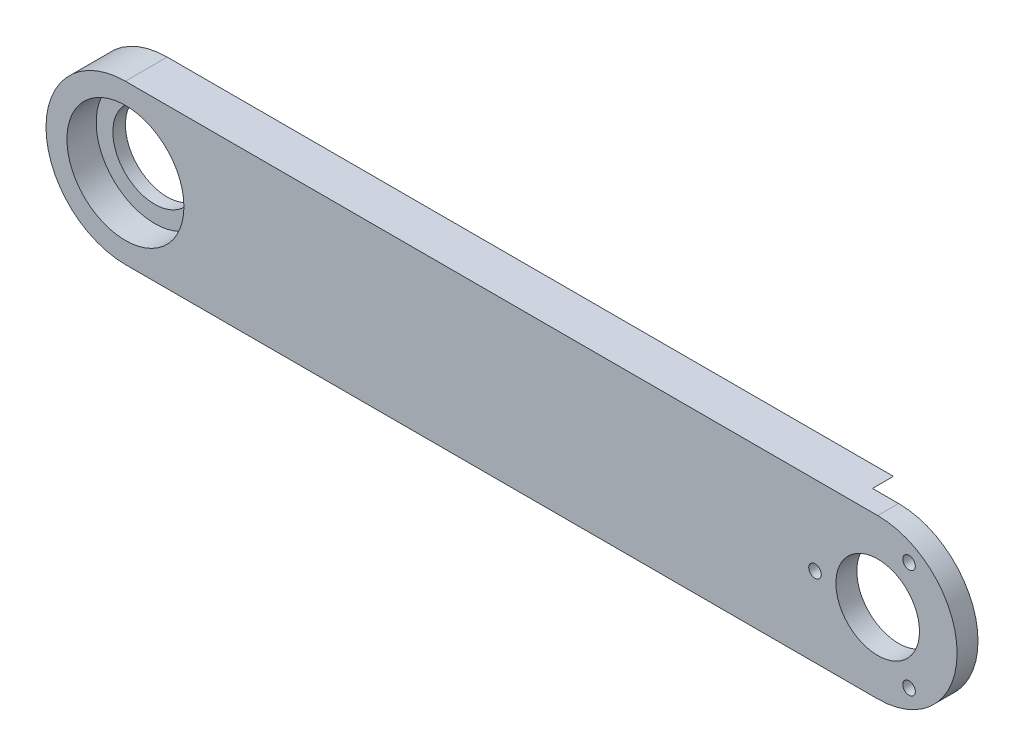
ISO-10303-21;
HEADER;
FILE_DESCRIPTION(('STEP AP214'),'2;1');
FILE_NAME('part.step','',(''),(''),'','','');
FILE_SCHEMA(('AUTOMOTIVE_DESIGN { 1 0 10303 214 1 1 1 1 }'));
ENDSEC;
DATA;
#1=APPLICATION_CONTEXT('core data for automotive mechanical design processes');
#2=APPLICATION_PROTOCOL_DEFINITION('international standard','automotive_design',2000,#1);
#3=PRODUCT_CONTEXT('',#1,'mechanical');
#4=PRODUCT('Part','Part','',(#3));
#5=PRODUCT_RELATED_PRODUCT_CATEGORY('part','',(#4));
#6=PRODUCT_DEFINITION_FORMATION('','',#4);
#7=PRODUCT_DEFINITION_CONTEXT('part definition',#1,'design');
#8=PRODUCT_DEFINITION('design','',#6,#7);
#9=PRODUCT_DEFINITION_SHAPE('','',#8);
#10=(LENGTH_UNIT() NAMED_UNIT(*) SI_UNIT(.MILLI.,.METRE.));
#11=(NAMED_UNIT(*) PLANE_ANGLE_UNIT() SI_UNIT($,.RADIAN.));
#12=(NAMED_UNIT(*) SI_UNIT($,.STERADIAN.) SOLID_ANGLE_UNIT());
#13=UNCERTAINTY_MEASURE_WITH_UNIT(LENGTH_MEASURE(1.E-05),#10,'distance_accuracy_value','');
#14=(GEOMETRIC_REPRESENTATION_CONTEXT(3) GLOBAL_UNCERTAINTY_ASSIGNED_CONTEXT((#13)) GLOBAL_UNIT_ASSIGNED_CONTEXT((#10,
#11,#12)) REPRESENTATION_CONTEXT('',''));
#15=CARTESIAN_POINT('',(0.,0.,0.));
#16=DIRECTION('',(0.,0.,1.));
#17=DIRECTION('',(1.,0.,0.));
#18=AXIS2_PLACEMENT_3D('',#15,#16,#17);
#19=CARTESIAN_POINT('',(0.,-19.,10.));
#20=DIRECTION('',(0.,1.,0.));
#21=DIRECTION('',(-1.,0.,0.));
#22=AXIS2_PLACEMENT_3D('',#19,#20,#21);
#23=PLANE('',#22);
#24=DIRECTION('',(0.,0.,-1.));
#25=VECTOR('',#24,1.);
#26=CARTESIAN_POINT('',(83.7550020016016,-19.,5.));
#27=LINE('',#26,#25);
#28=CARTESIAN_POINT('',(83.7550020016016,-19.,5.));
#29=VERTEX_POINT('',#28);
#30=CARTESIAN_POINT('',(83.7550020016016,-19.,0.));
#31=VERTEX_POINT('',#30);
#32=EDGE_CURVE('E55',#29,#31,#27,.T.);
#33=ORIENTED_EDGE('',*,*,#32,.F.);
#34=DIRECTION('',(1.,0.,0.));
#35=VECTOR('',#34,1.);
#36=CARTESIAN_POINT('',(0.,-19.,5.));
#37=LINE('',#36,#35);
#38=CARTESIAN_POINT('',(90.,-19.,5.));
#39=VERTEX_POINT('',#38);
#40=EDGE_CURVE('E116',#29,#39,#37,.T.);
#41=ORIENTED_EDGE('',*,*,#40,.T.);
#42=DIRECTION('',(0.,0.,-1.));
#43=VECTOR('',#42,1.);
#44=CARTESIAN_POINT('',(90.,-19.,10.));
#45=LINE('',#44,#43);
#46=CARTESIAN_POINT('',(90.,-19.,10.));
#47=VERTEX_POINT('',#46);
#48=EDGE_CURVE('E11',#47,#39,#45,.T.);
#49=ORIENTED_EDGE('',*,*,#48,.F.);
#50=DIRECTION('',(1.,0.,0.));
#51=VECTOR('',#50,1.);
#52=CARTESIAN_POINT('',(0.,-19.,10.));
#53=LINE('',#52,#51);
#54=CARTESIAN_POINT('',(-90.,-19.,10.));
#55=VERTEX_POINT('',#54);
#56=EDGE_CURVE('E147',#55,#47,#53,.T.);
#57=ORIENTED_EDGE('',*,*,#56,.F.);
#58=DIRECTION('',(0.,0.,-1.));
#59=VECTOR('',#58,1.);
#60=CARTESIAN_POINT('',(-90.,-19.,10.));
#61=LINE('',#60,#59);
#62=CARTESIAN_POINT('',(-90.,-19.,0.));
#63=VERTEX_POINT('',#62);
#64=EDGE_CURVE('E156',#55,#63,#61,.T.);
#65=ORIENTED_EDGE('',*,*,#64,.T.);
#66=DIRECTION('',(1.,0.,0.));
#67=VECTOR('',#66,1.);
#68=CARTESIAN_POINT('',(0.,-19.,0.));
#69=LINE('',#68,#67);
#70=EDGE_CURVE('E160',#63,#31,#69,.T.);
#71=ORIENTED_EDGE('',*,*,#70,.T.);
#72=EDGE_LOOP('',(#33,#41,#49,#57,#65,#71));
#73=FACE_BOUND('',#72,.T.);
#74=ADVANCED_FACE('F38',(#73),#23,.F.);
#75=CARTESIAN_POINT('',(0.,19.,10.));
#76=DIRECTION('',(0.,1.,0.));
#77=DIRECTION('',(-1.,0.,0.));
#78=AXIS2_PLACEMENT_3D('',#75,#76,#77);
#79=PLANE('',#78);
#80=DIRECTION('',(1.,0.,0.));
#81=VECTOR('',#80,1.);
#82=CARTESIAN_POINT('',(0.,19.,5.));
#83=LINE('',#82,#81);
#84=CARTESIAN_POINT('',(83.7550020016016,19.,5.));
#85=VERTEX_POINT('',#84);
#86=CARTESIAN_POINT('',(90.,19.,5.));
#87=VERTEX_POINT('',#86);
#88=EDGE_CURVE('E113',#85,#87,#83,.T.);
#89=ORIENTED_EDGE('',*,*,#88,.F.);
#90=DIRECTION('',(0.,0.,-1.));
#91=VECTOR('',#90,1.);
#92=CARTESIAN_POINT('',(83.7550020016016,19.,5.));
#93=LINE('',#92,#91);
#94=CARTESIAN_POINT('',(83.7550020016016,19.,0.));
#95=VERTEX_POINT('',#94);
#96=EDGE_CURVE('E101',#85,#95,#93,.T.);
#97=ORIENTED_EDGE('',*,*,#96,.T.);
#98=DIRECTION('',(1.,0.,0.));
#99=VECTOR('',#98,1.);
#100=CARTESIAN_POINT('',(0.,19.,0.));
#101=LINE('',#100,#99);
#102=CARTESIAN_POINT('',(-90.,19.,0.));
#103=VERTEX_POINT('',#102);
#104=EDGE_CURVE('E163',#103,#95,#101,.T.);
#105=ORIENTED_EDGE('',*,*,#104,.F.);
#106=DIRECTION('',(0.,0.,-1.));
#107=VECTOR('',#106,1.);
#108=CARTESIAN_POINT('',(-90.,19.,10.));
#109=LINE('',#108,#107);
#110=CARTESIAN_POINT('',(-90.,19.,10.));
#111=VERTEX_POINT('',#110);
#112=EDGE_CURVE('E167',#111,#103,#109,.T.);
#113=ORIENTED_EDGE('',*,*,#112,.F.);
#114=DIRECTION('',(1.,0.,0.));
#115=VECTOR('',#114,1.);
#116=CARTESIAN_POINT('',(0.,19.,10.));
#117=LINE('',#116,#115);
#118=CARTESIAN_POINT('',(90.,19.,10.));
#119=VERTEX_POINT('',#118);
#120=EDGE_CURVE('E150',#111,#119,#117,.T.);
#121=ORIENTED_EDGE('',*,*,#120,.T.);
#122=DIRECTION('',(0.,0.,-1.));
#123=VECTOR('',#122,1.);
#124=CARTESIAN_POINT('',(90.,19.,10.));
#125=LINE('',#124,#123);
#126=EDGE_CURVE('E47',#119,#87,#125,.T.);
#127=ORIENTED_EDGE('',*,*,#126,.T.);
#128=EDGE_LOOP('',(#89,#97,#105,#113,#121,#127));
#129=FACE_BOUND('',#128,.T.);
#130=ADVANCED_FACE('F119',(#129),#79,.T.);
#131=CARTESIAN_POINT('',(-90.,0.,10.));
#132=DIRECTION('',(0.,0.,-1.));
#133=DIRECTION('',(-1.,0.,0.));
#134=AXIS2_PLACEMENT_3D('',#131,#132,#133);
#135=CYLINDRICAL_SURFACE('',#134,9.99999999999999);
#136=CARTESIAN_POINT('',(-90.,0.,0.));
#137=DIRECTION('',(0.,0.,1.));
#138=DIRECTION('',(1.,0.,0.));
#139=AXIS2_PLACEMENT_3D('',#136,#137,#138);
#140=CIRCLE('',#139,9.99999999999999);
#141=CARTESIAN_POINT('',(-80.,0.,0.));
#142=VERTEX_POINT('',#141);
#143=EDGE_CURVE('E157',#142,#142,#140,.T.);
#144=ORIENTED_EDGE('',*,*,#143,.F.);
#145=EDGE_LOOP('',(#144));
#146=FACE_BOUND('',#145,.T.);
#147=CARTESIAN_POINT('',(-90.,0.,3.));
#148=DIRECTION('',(0.,0.,1.));
#149=DIRECTION('',(1.,0.,0.));
#150=AXIS2_PLACEMENT_3D('',#147,#148,#149);
#151=CIRCLE('',#150,9.99999999999999);
#152=CARTESIAN_POINT('',(-80.,0.,3.));
#153=VERTEX_POINT('',#152);
#154=EDGE_CURVE('E135',#153,#153,#151,.T.);
#155=ORIENTED_EDGE('',*,*,#154,.T.);
#156=EDGE_LOOP('',(#155));
#157=FACE_BOUND('',#156,.T.);
#158=ADVANCED_FACE('F172',(#146,#157),#135,.F.);
#159=CARTESIAN_POINT('',(90.,0.,10.));
#160=DIRECTION('',(0.,0.,-1.));
#161=DIRECTION('',(-1.,0.,0.));
#162=AXIS2_PLACEMENT_3D('',#159,#160,#161);
#163=CYLINDRICAL_SURFACE('',#162,19.);
#164=ORIENTED_EDGE('',*,*,#48,.T.);
#165=CARTESIAN_POINT('',(90.,0.,5.));
#166=DIRECTION('',(0.,0.,1.));
#167=DIRECTION('',(1.,0.,0.));
#168=AXIS2_PLACEMENT_3D('',#165,#166,#167);
#169=CIRCLE('',#168,19.);
#170=EDGE_CURVE('E121',#39,#87,#169,.T.);
#171=ORIENTED_EDGE('',*,*,#170,.T.);
#172=ORIENTED_EDGE('',*,*,#126,.F.);
#173=CARTESIAN_POINT('',(90.,0.,10.));
#174=DIRECTION('',(0.,0.,1.));
#175=DIRECTION('',(1.,0.,0.));
#176=AXIS2_PLACEMENT_3D('',#173,#174,#175);
#177=CIRCLE('',#176,19.);
#178=EDGE_CURVE('E86',#47,#119,#177,.T.);
#179=ORIENTED_EDGE('',*,*,#178,.F.);
#180=EDGE_LOOP('',(#164,#171,#172,#179));
#181=FACE_BOUND('',#180,.T.);
#182=ADVANCED_FACE('F222',(#181),#163,.T.);
#183=CARTESIAN_POINT('',(-90.,0.,10.));
#184=DIRECTION('',(0.,0.,-1.));
#185=DIRECTION('',(-1.,0.,0.));
#186=AXIS2_PLACEMENT_3D('',#183,#184,#185);
#187=CYLINDRICAL_SURFACE('',#186,19.);
#188=CARTESIAN_POINT('',(-90.,0.,0.));
#189=DIRECTION('',(0.,0.,1.));
#190=DIRECTION('',(1.,0.,0.));
#191=AXIS2_PLACEMENT_3D('',#188,#189,#190);
#192=CIRCLE('',#191,19.);
#193=EDGE_CURVE('E79',#103,#63,#192,.T.);
#194=ORIENTED_EDGE('',*,*,#193,.T.);
#195=ORIENTED_EDGE('',*,*,#64,.F.);
#196=CARTESIAN_POINT('',(-90.,0.,10.));
#197=DIRECTION('',(0.,0.,1.));
#198=DIRECTION('',(1.,0.,0.));
#199=AXIS2_PLACEMENT_3D('',#196,#197,#198);
#200=CIRCLE('',#199,19.);
#201=EDGE_CURVE('E64',#111,#55,#200,.T.);
#202=ORIENTED_EDGE('',*,*,#201,.F.);
#203=ORIENTED_EDGE('',*,*,#112,.T.);
#204=EDGE_LOOP('',(#194,#195,#202,#203));
#205=FACE_BOUND('',#204,.T.);
#206=ADVANCED_FACE('F228',(#205),#187,.T.);
#207=CARTESIAN_POINT('',(97.4999999999999,-12.9903810567666,10.));
#208=DIRECTION('',(0.,0.,-1.));
#209=DIRECTION('',(-1.,0.,0.));
#210=AXIS2_PLACEMENT_3D('',#207,#208,#209);
#211=CYLINDRICAL_SURFACE('',#210,1.49999999999994);
#212=CARTESIAN_POINT('',(97.4999999999999,-12.9903810567666,5.));
#213=DIRECTION('',(0.,0.,1.));
#214=DIRECTION('',(1.,0.,0.));
#215=AXIS2_PLACEMENT_3D('',#212,#213,#214);
#216=CIRCLE('',#215,1.49999999999994);
#217=CARTESIAN_POINT('',(98.9999999999999,-12.9903810567666,5.));
#218=VERTEX_POINT('',#217);
#219=EDGE_CURVE('E122',#218,#218,#216,.T.);
#220=ORIENTED_EDGE('',*,*,#219,.F.);
#221=EDGE_LOOP('',(#220));
#222=FACE_BOUND('',#221,.T.);
#223=CARTESIAN_POINT('',(97.4999999999999,-12.9903810567666,10.));
#224=DIRECTION('',(0.,0.,1.));
#225=DIRECTION('',(1.,0.,0.));
#226=AXIS2_PLACEMENT_3D('',#223,#224,#225);
#227=CIRCLE('',#226,1.49999999999994);
#228=CARTESIAN_POINT('',(98.9999999999999,-12.9903810567666,10.));
#229=VERTEX_POINT('',#228);
#230=EDGE_CURVE('E144',#229,#229,#227,.T.);
#231=ORIENTED_EDGE('',*,*,#230,.T.);
#232=EDGE_LOOP('',(#231));
#233=FACE_BOUND('',#232,.T.);
#234=ADVANCED_FACE('F226',(#222,#233),#211,.F.);
#235=CARTESIAN_POINT('',(97.5,12.9903810567666,10.));
#236=DIRECTION('',(0.,0.,-1.));
#237=DIRECTION('',(-1.,0.,0.));
#238=AXIS2_PLACEMENT_3D('',#235,#236,#237);
#239=CYLINDRICAL_SURFACE('',#238,1.49999999999995);
#240=CARTESIAN_POINT('',(97.5,12.9903810567666,5.));
#241=DIRECTION('',(0.,0.,1.));
#242=DIRECTION('',(1.,0.,0.));
#243=AXIS2_PLACEMENT_3D('',#240,#241,#242);
#244=CIRCLE('',#243,1.49999999999995);
#245=CARTESIAN_POINT('',(98.9999999999999,12.9903810567666,5.));
#246=VERTEX_POINT('',#245);
#247=EDGE_CURVE('E126',#246,#246,#244,.T.);
#248=ORIENTED_EDGE('',*,*,#247,.F.);
#249=EDGE_LOOP('',(#248));
#250=FACE_BOUND('',#249,.T.);
#251=CARTESIAN_POINT('',(97.5,12.9903810567666,10.));
#252=DIRECTION('',(0.,0.,1.));
#253=DIRECTION('',(1.,0.,0.));
#254=AXIS2_PLACEMENT_3D('',#251,#252,#253);
#255=CIRCLE('',#254,1.49999999999995);
#256=CARTESIAN_POINT('',(98.9999999999999,12.9903810567666,10.));
#257=VERTEX_POINT('',#256);
#258=EDGE_CURVE('E141',#257,#257,#255,.T.);
#259=ORIENTED_EDGE('',*,*,#258,.T.);
#260=EDGE_LOOP('',(#259));
#261=FACE_BOUND('',#260,.T.);
#262=ADVANCED_FACE('F208',(#250,#261),#239,.F.);
#263=CARTESIAN_POINT('',(75.,0.,10.));
#264=DIRECTION('',(0.,0.,-1.));
#265=DIRECTION('',(-1.,0.,0.));
#266=AXIS2_PLACEMENT_3D('',#263,#264,#265);
#267=CYLINDRICAL_SURFACE('',#266,1.49999999999994);
#268=CARTESIAN_POINT('',(75.,0.,5.));
#269=DIRECTION('',(0.,0.,1.));
#270=DIRECTION('',(1.,0.,0.));
#271=AXIS2_PLACEMENT_3D('',#268,#269,#270);
#272=CIRCLE('',#271,1.49999999999994);
#273=CARTESIAN_POINT('',(76.4999999999999,0.,5.));
#274=VERTEX_POINT('',#273);
#275=EDGE_CURVE('E238',#274,#274,#272,.T.);
#276=ORIENTED_EDGE('',*,*,#275,.F.);
#277=EDGE_LOOP('',(#276));
#278=FACE_BOUND('',#277,.T.);
#279=CARTESIAN_POINT('',(75.,0.,10.));
#280=DIRECTION('',(0.,0.,1.));
#281=DIRECTION('',(1.,0.,0.));
#282=AXIS2_PLACEMENT_3D('',#279,#280,#281);
#283=CIRCLE('',#282,1.49999999999994);
#284=CARTESIAN_POINT('',(76.4999999999999,0.,10.));
#285=VERTEX_POINT('',#284);
#286=EDGE_CURVE('E138',#285,#285,#283,.T.);
#287=ORIENTED_EDGE('',*,*,#286,.T.);
#288=EDGE_LOOP('',(#287));
#289=FACE_BOUND('',#288,.T.);
#290=ADVANCED_FACE('F40',(#278,#289),#267,.F.);
#291=CARTESIAN_POINT('',(90.,0.,10.));
#292=DIRECTION('',(0.,0.,-1.));
#293=DIRECTION('',(-1.,0.,0.));
#294=AXIS2_PLACEMENT_3D('',#291,#292,#293);
#295=CYLINDRICAL_SURFACE('',#294,9.99999999999999);
#296=CARTESIAN_POINT('',(90.,0.,5.));
#297=DIRECTION('',(0.,0.,1.));
#298=DIRECTION('',(1.,0.,0.));
#299=AXIS2_PLACEMENT_3D('',#296,#297,#298);
#300=CIRCLE('',#299,9.99999999999999);
#301=CARTESIAN_POINT('',(100.,0.,5.));
#302=VERTEX_POINT('',#301);
#303=EDGE_CURVE('E42',#302,#302,#300,.T.);
#304=ORIENTED_EDGE('',*,*,#303,.F.);
#305=EDGE_LOOP('',(#304));
#306=FACE_BOUND('',#305,.T.);
#307=CARTESIAN_POINT('',(90.,0.,10.));
#308=DIRECTION('',(0.,0.,1.));
#309=DIRECTION('',(1.,0.,0.));
#310=AXIS2_PLACEMENT_3D('',#307,#308,#309);
#311=CIRCLE('',#310,9.99999999999999);
#312=CARTESIAN_POINT('',(100.,0.,10.));
#313=VERTEX_POINT('',#312);
#314=EDGE_CURVE('E153',#313,#313,#311,.T.);
#315=ORIENTED_EDGE('',*,*,#314,.T.);
#316=EDGE_LOOP('',(#315));
#317=FACE_BOUND('',#316,.T.);
#318=ADVANCED_FACE('F190',(#306,#317),#295,.F.);
#319=CARTESIAN_POINT('',(0.,0.,10.));
#320=DIRECTION('',(0.,0.,1.));
#321=DIRECTION('',(1.,0.,0.));
#322=AXIS2_PLACEMENT_3D('',#319,#320,#321);
#323=PLANE('',#322);
#324=CARTESIAN_POINT('',(-90.,0.,10.));
#325=DIRECTION('',(0.,0.,1.));
#326=DIRECTION('',(1.,0.,0.));
#327=AXIS2_PLACEMENT_3D('',#324,#325,#326);
#328=CIRCLE('',#327,14.);
#329=CARTESIAN_POINT('',(-76.,0.,10.));
#330=VERTEX_POINT('',#329);
#331=EDGE_CURVE('E131',#330,#330,#328,.T.);
#332=ORIENTED_EDGE('',*,*,#331,.F.);
#333=EDGE_LOOP('',(#332));
#334=FACE_BOUND('',#333,.T.);
#335=ORIENTED_EDGE('',*,*,#286,.F.);
#336=EDGE_LOOP('',(#335));
#337=FACE_BOUND('',#336,.T.);
#338=ORIENTED_EDGE('',*,*,#258,.F.);
#339=EDGE_LOOP('',(#338));
#340=FACE_BOUND('',#339,.T.);
#341=ORIENTED_EDGE('',*,*,#230,.F.);
#342=EDGE_LOOP('',(#341));
#343=FACE_BOUND('',#342,.T.);
#344=ORIENTED_EDGE('',*,*,#56,.T.);
#345=ORIENTED_EDGE('',*,*,#178,.T.);
#346=ORIENTED_EDGE('',*,*,#120,.F.);
#347=ORIENTED_EDGE('',*,*,#201,.T.);
#348=EDGE_LOOP('',(#344,#345,#346,#347));
#349=FACE_BOUND('',#348,.T.);
#350=ORIENTED_EDGE('',*,*,#314,.F.);
#351=EDGE_LOOP('',(#350));
#352=FACE_BOUND('',#351,.T.);
#353=ADVANCED_FACE('F187',(#334,#337,#340,#343,#349,#352),#323,.T.);
#354=CARTESIAN_POINT('',(0.,0.,0.));
#355=DIRECTION('',(0.,0.,1.));
#356=DIRECTION('',(1.,0.,0.));
#357=AXIS2_PLACEMENT_3D('',#354,#355,#356);
#358=PLANE('',#357);
#359=CARTESIAN_POINT('',(90.,0.,0.));
#360=DIRECTION('',(0.,0.,1.));
#361=DIRECTION('',(1.,0.,0.));
#362=AXIS2_PLACEMENT_3D('',#359,#360,#361);
#363=CIRCLE('',#362,20.);
#364=EDGE_CURVE('E105',#95,#31,#363,.T.);
#365=ORIENTED_EDGE('',*,*,#364,.T.);
#366=ORIENTED_EDGE('',*,*,#70,.F.);
#367=ORIENTED_EDGE('',*,*,#193,.F.);
#368=ORIENTED_EDGE('',*,*,#104,.T.);
#369=EDGE_LOOP('',(#365,#366,#367,#368));
#370=FACE_BOUND('',#369,.T.);
#371=ORIENTED_EDGE('',*,*,#143,.T.);
#372=EDGE_LOOP('',(#371));
#373=FACE_BOUND('',#372,.T.);
#374=ADVANCED_FACE('F183',(#370,#373),#358,.F.);
#375=CARTESIAN_POINT('',(-90.,0.,3.));
#376=DIRECTION('',(0.,0.,1.));
#377=DIRECTION('',(1.,0.,0.));
#378=AXIS2_PLACEMENT_3D('',#375,#376,#377);
#379=CYLINDRICAL_SURFACE('',#378,14.);
#380=CARTESIAN_POINT('',(-90.,0.,3.));
#381=DIRECTION('',(0.,0.,1.));
#382=DIRECTION('',(1.,0.,0.));
#383=AXIS2_PLACEMENT_3D('',#380,#381,#382);
#384=CIRCLE('',#383,14.);
#385=CARTESIAN_POINT('',(-76.,0.,3.));
#386=VERTEX_POINT('',#385);
#387=EDGE_CURVE('E132',#386,#386,#384,.T.);
#388=ORIENTED_EDGE('',*,*,#387,.F.);
#389=EDGE_LOOP('',(#388));
#390=FACE_BOUND('',#389,.T.);
#391=ORIENTED_EDGE('',*,*,#331,.T.);
#392=EDGE_LOOP('',(#391));
#393=FACE_BOUND('',#392,.T.);
#394=ADVANCED_FACE('F177',(#390,#393),#379,.F.);
#395=CARTESIAN_POINT('',(-90.,0.,3.));
#396=DIRECTION('',(0.,0.,1.));
#397=DIRECTION('',(1.,0.,0.));
#398=AXIS2_PLACEMENT_3D('',#395,#396,#397);
#399=PLANE('',#398);
#400=ORIENTED_EDGE('',*,*,#154,.F.);
#401=EDGE_LOOP('',(#400));
#402=FACE_BOUND('',#401,.T.);
#403=ORIENTED_EDGE('',*,*,#387,.T.);
#404=EDGE_LOOP('',(#403));
#405=FACE_BOUND('',#404,.T.);
#406=ADVANCED_FACE('F174',(#402,#405),#399,.T.);
#407=CARTESIAN_POINT('',(90.,0.,5.));
#408=DIRECTION('',(0.,0.,1.));
#409=DIRECTION('',(1.,0.,0.));
#410=AXIS2_PLACEMENT_3D('',#407,#408,#409);
#411=PLANE('',#410);
#412=ORIENTED_EDGE('',*,*,#219,.T.);
#413=EDGE_LOOP('',(#412));
#414=FACE_BOUND('',#413,.T.);
#415=ORIENTED_EDGE('',*,*,#247,.T.);
#416=EDGE_LOOP('',(#415));
#417=FACE_BOUND('',#416,.T.);
#418=ORIENTED_EDGE('',*,*,#275,.T.);
#419=EDGE_LOOP('',(#418));
#420=FACE_BOUND('',#419,.T.);
#421=ORIENTED_EDGE('',*,*,#303,.T.);
#422=EDGE_LOOP('',(#421));
#423=FACE_BOUND('',#422,.T.);
#424=CARTESIAN_POINT('',(90.,0.,5.));
#425=DIRECTION('',(0.,0.,1.));
#426=DIRECTION('',(1.,0.,0.));
#427=AXIS2_PLACEMENT_3D('',#424,#425,#426);
#428=CIRCLE('',#427,20.);
#429=EDGE_CURVE('E104',#85,#29,#428,.T.);
#430=ORIENTED_EDGE('',*,*,#429,.F.);
#431=ORIENTED_EDGE('',*,*,#88,.T.);
#432=ORIENTED_EDGE('',*,*,#170,.F.);
#433=ORIENTED_EDGE('',*,*,#40,.F.);
#434=EDGE_LOOP('',(#430,#431,#432,#433));
#435=FACE_BOUND('',#434,.T.);
#436=ADVANCED_FACE('F112',(#414,#417,#420,#423,#435),#411,.F.);
#437=CARTESIAN_POINT('',(90.,0.,5.));
#438=DIRECTION('',(0.,0.,-1.));
#439=DIRECTION('',(-1.,0.,0.));
#440=AXIS2_PLACEMENT_3D('',#437,#438,#439);
#441=CYLINDRICAL_SURFACE('',#440,20.);
#442=ORIENTED_EDGE('',*,*,#32,.T.);
#443=ORIENTED_EDGE('',*,*,#364,.F.);
#444=ORIENTED_EDGE('',*,*,#96,.F.);
#445=ORIENTED_EDGE('',*,*,#429,.T.);
#446=EDGE_LOOP('',(#442,#443,#444,#445));
#447=FACE_BOUND('',#446,.T.);
#448=ADVANCED_FACE('F103',(#447),#441,.F.);
#449=CLOSED_SHELL('',(#74,#130,#158,#182,#206,#234,#262,#290,#318,#353,#374,#394,#406,#436,#448));
#450=MANIFOLD_SOLID_BREP('B2',#449);
#451=ADVANCED_BREP_SHAPE_REPRESENTATION('',(#18,#450),#14);
#452=SHAPE_DEFINITION_REPRESENTATION(#9,#451);
ENDSEC;
END-ISO-10303-21;
